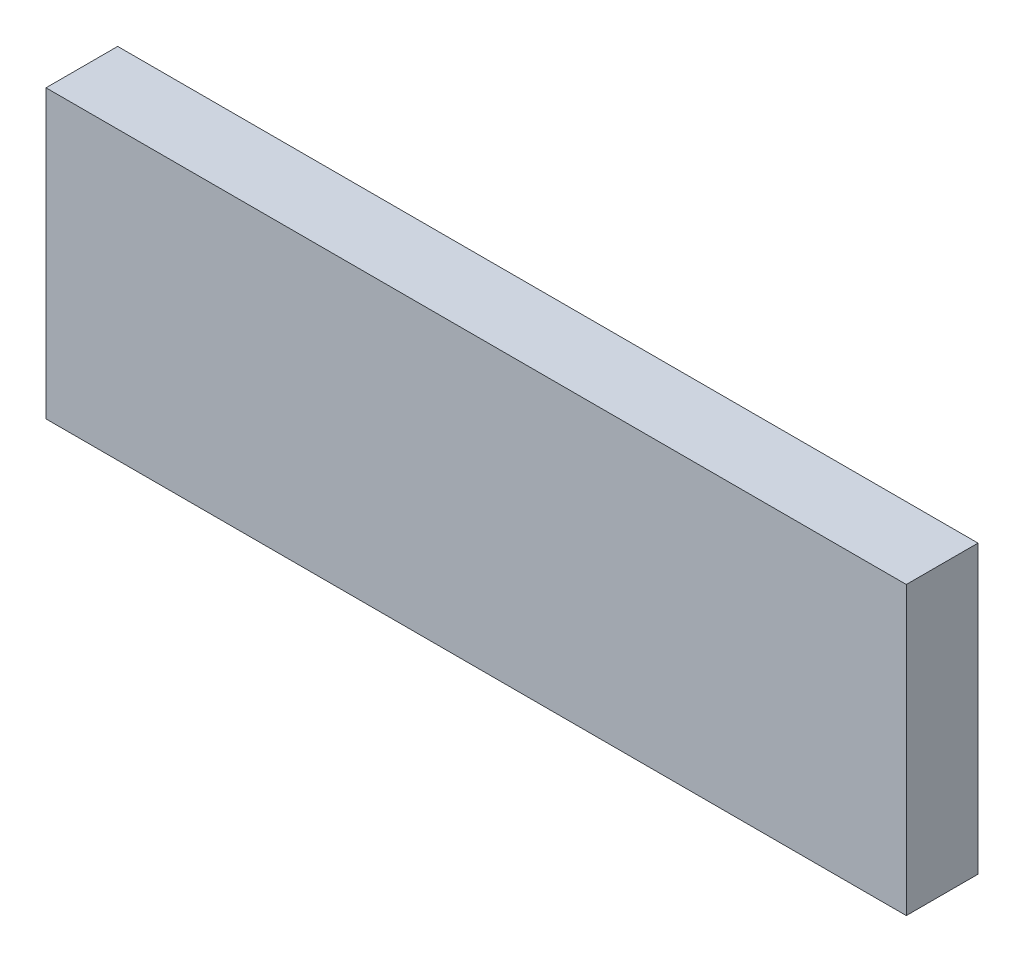
ISO-10303-21;
HEADER;
FILE_DESCRIPTION(('STEP AP214'),'2;1');
FILE_NAME('part.step','',(''),(''),'','','');
FILE_SCHEMA(('AUTOMOTIVE_DESIGN { 1 0 10303 214 1 1 1 1 }'));
ENDSEC;
DATA;
#1=APPLICATION_CONTEXT('core data for automotive mechanical design processes');
#2=APPLICATION_PROTOCOL_DEFINITION('international standard','automotive_design',2000,#1);
#3=PRODUCT_CONTEXT('',#1,'mechanical');
#4=PRODUCT('Part','Part','',(#3));
#5=PRODUCT_RELATED_PRODUCT_CATEGORY('part','',(#4));
#6=PRODUCT_DEFINITION_FORMATION('','',#4);
#7=PRODUCT_DEFINITION_CONTEXT('part definition',#1,'design');
#8=PRODUCT_DEFINITION('design','',#6,#7);
#9=PRODUCT_DEFINITION_SHAPE('','',#8);
#10=(LENGTH_UNIT() NAMED_UNIT(*) SI_UNIT(.MILLI.,.METRE.));
#11=(NAMED_UNIT(*) PLANE_ANGLE_UNIT() SI_UNIT($,.RADIAN.));
#12=(NAMED_UNIT(*) SI_UNIT($,.STERADIAN.) SOLID_ANGLE_UNIT());
#13=UNCERTAINTY_MEASURE_WITH_UNIT(LENGTH_MEASURE(1.E-05),#10,'distance_accuracy_value','');
#14=(GEOMETRIC_REPRESENTATION_CONTEXT(3) GLOBAL_UNCERTAINTY_ASSIGNED_CONTEXT((#13)) GLOBAL_UNIT_ASSIGNED_CONTEXT((#10,
#11,#12)) REPRESENTATION_CONTEXT('',''));
#15=CARTESIAN_POINT('',(0.,0.,0.));
#16=DIRECTION('',(0.,0.,1.));
#17=DIRECTION('',(1.,0.,0.));
#18=AXIS2_PLACEMENT_3D('',#15,#16,#17);
#19=CARTESIAN_POINT('',(76.2,-25.4,12.7));
#20=DIRECTION('',(-1.,0.,0.));
#21=DIRECTION('',(0.,0.,1.));
#22=AXIS2_PLACEMENT_3D('',#19,#20,#21);
#23=PLANE('',#22);
#24=DIRECTION('',(0.,1.,0.));
#25=VECTOR('',#24,1.);
#26=CARTESIAN_POINT('',(76.2,-25.4,0.));
#27=LINE('',#26,#25);
#28=CARTESIAN_POINT('',(76.2,-25.4,0.));
#29=VERTEX_POINT('',#28);
#30=CARTESIAN_POINT('',(76.2,25.4,0.));
#31=VERTEX_POINT('',#30);
#32=EDGE_CURVE('E97',#29,#31,#27,.T.);
#33=ORIENTED_EDGE('',*,*,#32,.T.);
#34=DIRECTION('',(0.,0.,-1.));
#35=VECTOR('',#34,1.);
#36=CARTESIAN_POINT('',(76.2,25.4,12.7));
#37=LINE('',#36,#35);
#38=CARTESIAN_POINT('',(76.2,25.4,12.7));
#39=VERTEX_POINT('',#38);
#40=EDGE_CURVE('E11',#39,#31,#37,.T.);
#41=ORIENTED_EDGE('',*,*,#40,.F.);
#42=DIRECTION('',(0.,1.,0.));
#43=VECTOR('',#42,1.);
#44=CARTESIAN_POINT('',(76.2,-25.4,12.7));
#45=LINE('',#44,#43);
#46=CARTESIAN_POINT('',(76.2,-25.4,12.7));
#47=VERTEX_POINT('',#46);
#48=EDGE_CURVE('E85',#47,#39,#45,.T.);
#49=ORIENTED_EDGE('',*,*,#48,.F.);
#50=DIRECTION('',(0.,0.,-1.));
#51=VECTOR('',#50,1.);
#52=CARTESIAN_POINT('',(76.2,-25.4,12.7));
#53=LINE('',#52,#51);
#54=EDGE_CURVE('E93',#47,#29,#53,.T.);
#55=ORIENTED_EDGE('',*,*,#54,.T.);
#56=EDGE_LOOP('',(#33,#41,#49,#55));
#57=FACE_BOUND('',#56,.T.);
#58=ADVANCED_FACE('F34',(#57),#23,.F.);
#59=CARTESIAN_POINT('',(-76.2,25.4,12.7));
#60=DIRECTION('',(0.,-1.,0.));
#61=DIRECTION('',(0.,0.,-1.));
#62=AXIS2_PLACEMENT_3D('',#59,#60,#61);
#63=PLANE('',#62);
#64=DIRECTION('',(-1.,0.,0.));
#65=VECTOR('',#64,1.);
#66=CARTESIAN_POINT('',(-76.2,25.4,0.));
#67=LINE('',#66,#65);
#68=CARTESIAN_POINT('',(-76.2,25.4,0.));
#69=VERTEX_POINT('',#68);
#70=EDGE_CURVE('E89',#31,#69,#67,.T.);
#71=ORIENTED_EDGE('',*,*,#70,.T.);
#72=DIRECTION('',(0.,0.,-1.));
#73=VECTOR('',#72,1.);
#74=CARTESIAN_POINT('',(-76.2,25.4,12.7));
#75=LINE('',#74,#73);
#76=CARTESIAN_POINT('',(-76.2,25.4,12.7));
#77=VERTEX_POINT('',#76);
#78=EDGE_CURVE('E42',#77,#69,#75,.T.);
#79=ORIENTED_EDGE('',*,*,#78,.F.);
#80=DIRECTION('',(-1.,0.,0.));
#81=VECTOR('',#80,1.);
#82=CARTESIAN_POINT('',(-76.2,25.4,12.7));
#83=LINE('',#82,#81);
#84=EDGE_CURVE('E80',#39,#77,#83,.T.);
#85=ORIENTED_EDGE('',*,*,#84,.F.);
#86=ORIENTED_EDGE('',*,*,#40,.T.);
#87=EDGE_LOOP('',(#71,#79,#85,#86));
#88=FACE_BOUND('',#87,.T.);
#89=ADVANCED_FACE('F88',(#88),#63,.F.);
#90=CARTESIAN_POINT('',(-76.2,-25.4,12.7));
#91=DIRECTION('',(1.,0.,0.));
#92=DIRECTION('',(0.,0.,-1.));
#93=AXIS2_PLACEMENT_3D('',#90,#91,#92);
#94=PLANE('',#93);
#95=DIRECTION('',(0.,-1.,0.));
#96=VECTOR('',#95,1.);
#97=CARTESIAN_POINT('',(-76.2,-25.4,0.));
#98=LINE('',#97,#96);
#99=CARTESIAN_POINT('',(-76.2,-25.4,0.));
#100=VERTEX_POINT('',#99);
#101=EDGE_CURVE('E67',#69,#100,#98,.T.);
#102=ORIENTED_EDGE('',*,*,#101,.T.);
#103=DIRECTION('',(0.,0.,-1.));
#104=VECTOR('',#103,1.);
#105=CARTESIAN_POINT('',(-76.2,-25.4,12.7));
#106=LINE('',#105,#104);
#107=CARTESIAN_POINT('',(-76.2,-25.4,12.7));
#108=VERTEX_POINT('',#107);
#109=EDGE_CURVE('E90',#108,#100,#106,.T.);
#110=ORIENTED_EDGE('',*,*,#109,.F.);
#111=DIRECTION('',(0.,-1.,0.));
#112=VECTOR('',#111,1.);
#113=CARTESIAN_POINT('',(-76.2,-25.4,12.7));
#114=LINE('',#113,#112);
#115=EDGE_CURVE('E83',#77,#108,#114,.T.);
#116=ORIENTED_EDGE('',*,*,#115,.F.);
#117=ORIENTED_EDGE('',*,*,#78,.T.);
#118=EDGE_LOOP('',(#102,#110,#116,#117));
#119=FACE_BOUND('',#118,.T.);
#120=ADVANCED_FACE('F91',(#119),#94,.F.);
#121=CARTESIAN_POINT('',(-76.2,-25.4,12.7));
#122=DIRECTION('',(0.,1.,0.));
#123=DIRECTION('',(0.,0.,1.));
#124=AXIS2_PLACEMENT_3D('',#121,#122,#123);
#125=PLANE('',#124);
#126=DIRECTION('',(1.,0.,0.));
#127=VECTOR('',#126,1.);
#128=CARTESIAN_POINT('',(-76.2,-25.4,0.));
#129=LINE('',#128,#127);
#130=EDGE_CURVE('E73',#100,#29,#129,.T.);
#131=ORIENTED_EDGE('',*,*,#130,.T.);
#132=ORIENTED_EDGE('',*,*,#54,.F.);
#133=DIRECTION('',(1.,0.,0.));
#134=VECTOR('',#133,1.);
#135=CARTESIAN_POINT('',(-76.2,-25.4,12.7));
#136=LINE('',#135,#134);
#137=EDGE_CURVE('E50',#108,#47,#136,.T.);
#138=ORIENTED_EDGE('',*,*,#137,.F.);
#139=ORIENTED_EDGE('',*,*,#109,.T.);
#140=EDGE_LOOP('',(#131,#132,#138,#139));
#141=FACE_BOUND('',#140,.T.);
#142=ADVANCED_FACE('F104',(#141),#125,.F.);
#143=CARTESIAN_POINT('',(0.,0.,12.7));
#144=DIRECTION('',(0.,0.,-1.));
#145=DIRECTION('',(-1.,0.,0.));
#146=AXIS2_PLACEMENT_3D('',#143,#144,#145);
#147=PLANE('',#146);
#148=ORIENTED_EDGE('',*,*,#48,.T.);
#149=ORIENTED_EDGE('',*,*,#84,.T.);
#150=ORIENTED_EDGE('',*,*,#115,.T.);
#151=ORIENTED_EDGE('',*,*,#137,.T.);
#152=EDGE_LOOP('',(#148,#149,#150,#151));
#153=FACE_BOUND('',#152,.T.);
#154=ADVANCED_FACE('F81',(#153),#147,.F.);
#155=CARTESIAN_POINT('',(0.,0.,0.));
#156=DIRECTION('',(0.,0.,-1.));
#157=DIRECTION('',(-1.,0.,0.));
#158=AXIS2_PLACEMENT_3D('',#155,#156,#157);
#159=PLANE('',#158);
#160=ORIENTED_EDGE('',*,*,#32,.F.);
#161=ORIENTED_EDGE('',*,*,#130,.F.);
#162=ORIENTED_EDGE('',*,*,#101,.F.);
#163=ORIENTED_EDGE('',*,*,#70,.F.);
#164=EDGE_LOOP('',(#160,#161,#162,#163));
#165=FACE_BOUND('',#164,.T.);
#166=ADVANCED_FACE('F107',(#165),#159,.T.);
#167=CLOSED_SHELL('',(#58,#89,#120,#142,#154,#166));
#168=MANIFOLD_SOLID_BREP('B2',#167);
#169=ADVANCED_BREP_SHAPE_REPRESENTATION('',(#18,#168),#14);
#170=SHAPE_DEFINITION_REPRESENTATION(#9,#169);
ENDSEC;
END-ISO-10303-21;
